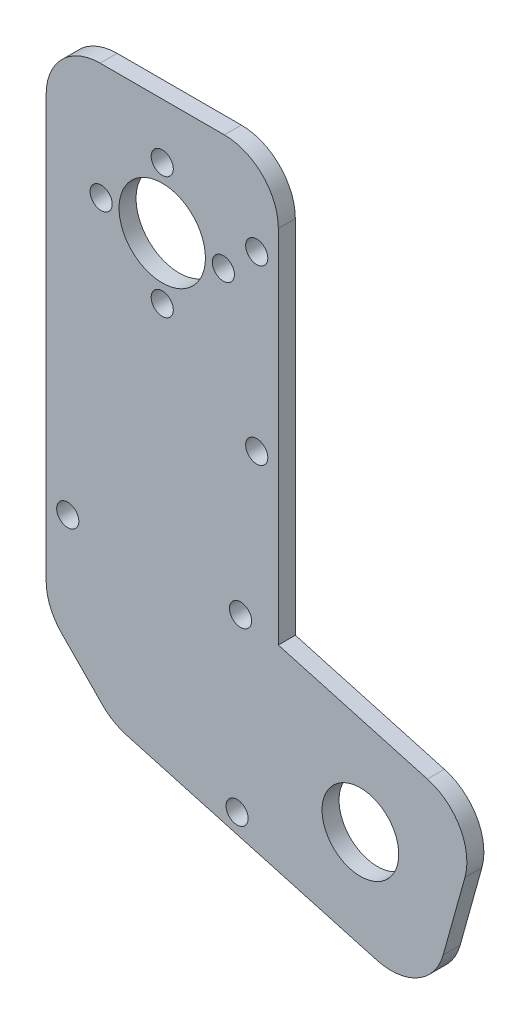
ISO-10303-21;
HEADER;
FILE_DESCRIPTION(('STEP AP214'),'2;1');
FILE_NAME('part.step','',(''),(''),'','','');
FILE_SCHEMA(('AUTOMOTIVE_DESIGN { 1 0 10303 214 1 1 1 1 }'));
ENDSEC;
DATA;
#1=APPLICATION_CONTEXT('core data for automotive mechanical design processes');
#2=APPLICATION_PROTOCOL_DEFINITION('international standard','automotive_design',2000,#1);
#3=PRODUCT_CONTEXT('',#1,'mechanical');
#4=PRODUCT('Part','Part','',(#3));
#5=PRODUCT_RELATED_PRODUCT_CATEGORY('part','',(#4));
#6=PRODUCT_DEFINITION_FORMATION('','',#4);
#7=PRODUCT_DEFINITION_CONTEXT('part definition',#1,'design');
#8=PRODUCT_DEFINITION('design','',#6,#7);
#9=PRODUCT_DEFINITION_SHAPE('','',#8);
#10=(LENGTH_UNIT() NAMED_UNIT(*) SI_UNIT(.MILLI.,.METRE.));
#11=(NAMED_UNIT(*) PLANE_ANGLE_UNIT() SI_UNIT($,.RADIAN.));
#12=(NAMED_UNIT(*) SI_UNIT($,.STERADIAN.) SOLID_ANGLE_UNIT());
#13=UNCERTAINTY_MEASURE_WITH_UNIT(LENGTH_MEASURE(1.E-05),#10,'distance_accuracy_value','');
#14=(GEOMETRIC_REPRESENTATION_CONTEXT(3) GLOBAL_UNCERTAINTY_ASSIGNED_CONTEXT((#13)) GLOBAL_UNIT_ASSIGNED_CONTEXT((#10,
#11,#12)) REPRESENTATION_CONTEXT('',''));
#15=CARTESIAN_POINT('',(0.,0.,0.));
#16=DIRECTION('',(0.,0.,1.));
#17=DIRECTION('',(1.,0.,0.));
#18=AXIS2_PLACEMENT_3D('',#15,#16,#17);
#19=CARTESIAN_POINT('',(338.738353449276,-520.512689349728,3.15));
#20=DIRECTION('',(0.,0.,1.));
#21=DIRECTION('',(1.,0.,0.));
#22=AXIS2_PLACEMENT_3D('',#19,#20,#21);
#23=PLANE('',#22);
#24=CARTESIAN_POINT('',(367.738353449277,-558.262689349727,3.15));
#25=DIRECTION('',(0.,0.,1.));
#26=DIRECTION('',(1.,0.,0.));
#27=AXIS2_PLACEMENT_3D('',#24,#25,#26);
#28=CIRCLE('',#27,2.05000000000001);
#29=CARTESIAN_POINT('',(369.788353449277,-558.262689349727,3.15));
#30=VERTEX_POINT('',#29);
#31=EDGE_CURVE('E475',#30,#30,#28,.T.);
#32=ORIENTED_EDGE('',*,*,#31,.F.);
#33=EDGE_LOOP('',(#32));
#34=FACE_BOUND('',#33,.T.);
#35=CARTESIAN_POINT('',(367.738353449277,-526.262689349727,3.15));
#36=DIRECTION('',(0.,0.,1.));
#37=DIRECTION('',(1.,0.,0.));
#38=AXIS2_PLACEMENT_3D('',#35,#36,#37);
#39=CIRCLE('',#38,2.05000000000001);
#40=CARTESIAN_POINT('',(369.788353449277,-526.262689349727,3.15));
#41=VERTEX_POINT('',#40);
#42=EDGE_CURVE('E482',#41,#41,#39,.T.);
#43=ORIENTED_EDGE('',*,*,#42,.F.);
#44=EDGE_LOOP('',(#43));
#45=FACE_BOUND('',#44,.T.);
#46=CARTESIAN_POINT('',(364.09835344927,-617.962689349723,3.15));
#47=DIRECTION('',(0.,0.,1.));
#48=DIRECTION('',(1.,0.,0.));
#49=AXIS2_PLACEMENT_3D('',#46,#47,#48);
#50=CIRCLE('',#49,2.05000000000001);
#51=CARTESIAN_POINT('',(366.14835344927,-617.962689349723,3.15));
#52=VERTEX_POINT('',#51);
#53=EDGE_CURVE('E498',#52,#52,#50,.T.);
#54=ORIENTED_EDGE('',*,*,#53,.F.);
#55=EDGE_LOOP('',(#54));
#56=FACE_BOUND('',#55,.T.);
#57=CARTESIAN_POINT('',(332.738353449277,-585.962689349728,3.15));
#58=DIRECTION('',(0.,0.,1.));
#59=DIRECTION('',(1.,0.,0.));
#60=AXIS2_PLACEMENT_3D('',#57,#58,#59);
#61=CIRCLE('',#60,2.05000000000001);
#62=CARTESIAN_POINT('',(334.788353449277,-585.962689349728,3.15));
#63=VERTEX_POINT('',#62);
#64=EDGE_CURVE('E514',#63,#63,#61,.T.);
#65=ORIENTED_EDGE('',*,*,#64,.F.);
#66=EDGE_LOOP('',(#65));
#67=FACE_BOUND('',#66,.T.);
#68=CARTESIAN_POINT('',(338.738353449276,-520.512689349728,3.15));
#69=DIRECTION('',(0.,0.,1.));
#70=DIRECTION('',(1.,0.,0.));
#71=AXIS2_PLACEMENT_3D('',#68,#69,#70);
#72=CIRCLE('',#71,9.99999999999973);
#73=CARTESIAN_POINT('',(338.738353449275,-510.512689349728,3.15));
#74=VERTEX_POINT('',#73);
#75=CARTESIAN_POINT('',(328.738353449277,-520.512689349728,3.15));
#76=VERTEX_POINT('',#75);
#77=EDGE_CURVE('E316',#74,#76,#72,.T.);
#78=ORIENTED_EDGE('',*,*,#77,.T.);
#79=DIRECTION('',(0.,-1.,0.));
#80=VECTOR('',#79,1.);
#81=CARTESIAN_POINT('',(328.738353449277,-520.512689349728,3.15));
#82=LINE('',#81,#80);
#83=CARTESIAN_POINT('',(328.738353449277,-598.517239389052,3.15));
#84=VERTEX_POINT('',#83);
#85=EDGE_CURVE('E222',#76,#84,#82,.T.);
#86=ORIENTED_EDGE('',*,*,#85,.T.);
#87=CARTESIAN_POINT('',(338.738353449279,-598.517239389052,3.15));
#88=DIRECTION('',(0.,0.,1.));
#89=DIRECTION('',(1.,0.,0.));
#90=AXIS2_PLACEMENT_3D('',#87,#88,#89);
#91=CIRCLE('',#90,10.0000000000021);
#92=CARTESIAN_POINT('',(331.605848957736,-605.526332032052,3.15));
#93=VERTEX_POINT('',#92);
#94=EDGE_CURVE('E357',#84,#93,#91,.T.);
#95=ORIENTED_EDGE('',*,*,#94,.T.);
#96=DIRECTION('',(0.700909264299887,-0.713250449154146,0.));
#97=VECTOR('',#96,1.);
#98=CARTESIAN_POINT('',(331.605848957736,-605.526332032052,3.15));
#99=LINE('',#98,#97);
#100=CARTESIAN_POINT('',(339.160008991501,-613.213501130105,3.15));
#101=VERTEX_POINT('',#100);
#102=EDGE_CURVE('E377',#93,#101,#99,.T.);
#103=ORIENTED_EDGE('',*,*,#102,.T.);
#104=CARTESIAN_POINT('',(346.292513483043,-606.204408487105,3.15));
#105=DIRECTION('',(0.,0.,1.));
#106=DIRECTION('',(1.,0.,0.));
#107=AXIS2_PLACEMENT_3D('',#104,#105,#106);
#108=CIRCLE('',#107,10.0000000000005);
#109=CARTESIAN_POINT('',(343.608612936547,-615.837511717971,3.15));
#110=VERTEX_POINT('',#109);
#111=EDGE_CURVE('E373',#101,#110,#108,.T.);
#112=ORIENTED_EDGE('',*,*,#111,.T.);
#113=DIRECTION('',(0.963310323086718,-0.268390054649131,0.));
#114=VECTOR('',#113,1.);
#115=CARTESIAN_POINT('',(343.608612936547,-615.837511717969,3.15));
#116=LINE('',#115,#114);
#117=CARTESIAN_POINT('',(389.943798738225,-628.747061996266,3.15));
#118=VERTEX_POINT('',#117);
#119=EDGE_CURVE('E376',#110,#118,#116,.T.);
#120=ORIENTED_EDGE('',*,*,#119,.T.);
#121=CARTESIAN_POINT('',(392.627699284721,-619.113958765401,3.15));
#122=DIRECTION('',(0.,0.,1.));
#123=DIRECTION('',(1.,0.,0.));
#124=AXIS2_PLACEMENT_3D('',#121,#122,#123);
#125=CIRCLE('',#124,9.99999999999827);
#126=CARTESIAN_POINT('',(402.260802515585,-621.797859311897,3.15));
#127=VERTEX_POINT('',#126);
#128=EDGE_CURVE('E381',#118,#127,#125,.T.);
#129=ORIENTED_EDGE('',*,*,#128,.T.);
#130=DIRECTION('',(0.268390054649557,0.963310323086599,0.));
#131=VECTOR('',#130,1.);
#132=CARTESIAN_POINT('',(402.260802515584,-621.797859311897,3.15));
#133=LINE('',#132,#131);
#134=CARTESIAN_POINT('',(406.28749809308,-607.345172446158,3.15));
#135=VERTEX_POINT('',#134);
#136=EDGE_CURVE('E388',#127,#135,#133,.T.);
#137=ORIENTED_EDGE('',*,*,#136,.T.);
#138=CARTESIAN_POINT('',(396.654394862209,-604.661271899663,3.15));
#139=DIRECTION('',(0.,0.,1.));
#140=DIRECTION('',(1.,0.,0.));
#141=AXIS2_PLACEMENT_3D('',#138,#139,#140);
#142=CIRCLE('',#141,10.0000000000016);
#143=CARTESIAN_POINT('',(399.338295408697,-595.028168668793,3.15));
#144=VERTEX_POINT('',#143);
#145=EDGE_CURVE('E391',#135,#144,#142,.T.);
#146=ORIENTED_EDGE('',*,*,#145,.T.);
#147=DIRECTION('',(-0.963310323086717,0.268390054649132,0.));
#148=VECTOR('',#147,1.);
#149=CARTESIAN_POINT('',(399.338295408697,-595.028168668796,3.15));
#150=LINE('',#149,#148);
#151=CARTESIAN_POINT('',(371.738353449277,-587.338486794459,3.15));
#152=VERTEX_POINT('',#151);
#153=EDGE_CURVE('E256',#144,#152,#150,.T.);
#154=ORIENTED_EDGE('',*,*,#153,.T.);
#155=DIRECTION('',(0.,1.,0.));
#156=VECTOR('',#155,1.);
#157=CARTESIAN_POINT('',(371.738353449277,-587.338486794459,3.15));
#158=LINE('',#157,#156);
#159=CARTESIAN_POINT('',(371.738353449277,-520.512689349726,3.15));
#160=VERTEX_POINT('',#159);
#161=EDGE_CURVE('E250',#152,#160,#158,.T.);
#162=ORIENTED_EDGE('',*,*,#161,.T.);
#163=CARTESIAN_POINT('',(361.738353449276,-520.512689349727,3.15));
#164=DIRECTION('',(0.,0.,1.));
#165=DIRECTION('',(1.,0.,0.));
#166=AXIS2_PLACEMENT_3D('',#163,#164,#165);
#167=CIRCLE('',#166,10.0000000000001);
#168=CARTESIAN_POINT('',(361.738353449275,-510.512689349727,3.15));
#169=VERTEX_POINT('',#168);
#170=EDGE_CURVE('E254',#160,#169,#167,.T.);
#171=ORIENTED_EDGE('',*,*,#170,.T.);
#172=DIRECTION('',(-1.,0.,0.));
#173=VECTOR('',#172,1.);
#174=CARTESIAN_POINT('',(361.738353449275,-510.512689349727,3.15));
#175=LINE('',#174,#173);
#176=EDGE_CURVE('E164',#169,#74,#175,.T.);
#177=ORIENTED_EDGE('',*,*,#176,.T.);
#178=EDGE_LOOP('',(#78,#86,#95,#103,#112,#120,#129,#137,#146,#154,#162,#171,#177));
#179=FACE_BOUND('',#178,.T.);
#180=CARTESIAN_POINT('',(364.738353449277,-585.962689349726,3.15));
#181=DIRECTION('',(0.,0.,1.));
#182=DIRECTION('',(1.,0.,0.));
#183=AXIS2_PLACEMENT_3D('',#180,#181,#182);
#184=CIRCLE('',#183,2.05000000000001);
#185=CARTESIAN_POINT('',(366.788353449277,-585.962689349726,3.15));
#186=VERTEX_POINT('',#185);
#187=EDGE_CURVE('E506',#186,#186,#184,.T.);
#188=ORIENTED_EDGE('',*,*,#187,.F.);
#189=EDGE_LOOP('',(#188));
#190=FACE_BOUND('',#189,.T.);
#191=CARTESIAN_POINT('',(386.934986867648,-609.73897888562,3.15));
#192=DIRECTION('',(0.,0.,1.));
#193=DIRECTION('',(1.,0.,0.));
#194=AXIS2_PLACEMENT_3D('',#191,#192,#193);
#195=CIRCLE('',#194,7.09999999999959);
#196=CARTESIAN_POINT('',(394.034986867648,-609.73897888562,3.15));
#197=VERTEX_POINT('',#196);
#198=EDGE_CURVE('E490',#197,#197,#195,.T.);
#199=ORIENTED_EDGE('',*,*,#198,.F.);
#200=EDGE_LOOP('',(#199));
#201=FACE_BOUND('',#200,.T.);
#202=CARTESIAN_POINT('',(350.23835344928,-543.326397848709,3.15));
#203=DIRECTION('',(0.,0.,1.));
#204=DIRECTION('',(1.,0.,0.));
#205=AXIS2_PLACEMENT_3D('',#202,#203,#204);
#206=CIRCLE('',#205,2.05000000000001);
#207=CARTESIAN_POINT('',(352.28835344928,-543.326397848709,3.15));
#208=VERTEX_POINT('',#207);
#209=EDGE_CURVE('E530',#208,#208,#206,.T.);
#210=ORIENTED_EDGE('',*,*,#209,.F.);
#211=EDGE_LOOP('',(#210));
#212=FACE_BOUND('',#211,.T.);
#213=CARTESIAN_POINT('',(350.23835344928,-520.69898085074,3.15));
#214=DIRECTION('',(0.,0.,1.));
#215=DIRECTION('',(1.,0.,0.));
#216=AXIS2_PLACEMENT_3D('',#213,#214,#215);
#217=CIRCLE('',#216,2.05000000000001);
#218=CARTESIAN_POINT('',(352.28835344928,-520.69898085074,3.15));
#219=VERTEX_POINT('',#218);
#220=EDGE_CURVE('E546',#219,#219,#217,.T.);
#221=ORIENTED_EDGE('',*,*,#220,.F.);
#222=EDGE_LOOP('',(#221));
#223=FACE_BOUND('',#222,.T.);
#224=CARTESIAN_POINT('',(350.23835344928,-532.012689349725,3.15));
#225=DIRECTION('',(0.,0.,1.));
#226=DIRECTION('',(1.,0.,0.));
#227=AXIS2_PLACEMENT_3D('',#224,#225,#226);
#228=CIRCLE('',#227,7.99999999999667);
#229=CARTESIAN_POINT('',(358.238353449277,-532.012689349725,3.15));
#230=VERTEX_POINT('',#229);
#231=EDGE_CURVE('E283',#230,#230,#228,.T.);
#232=ORIENTED_EDGE('',*,*,#231,.F.);
#233=EDGE_LOOP('',(#232));
#234=FACE_BOUND('',#233,.T.);
#235=CARTESIAN_POINT('',(361.552061948265,-532.012689349725,3.15));
#236=DIRECTION('',(0.,0.,1.));
#237=DIRECTION('',(1.,0.,0.));
#238=AXIS2_PLACEMENT_3D('',#235,#236,#237);
#239=CIRCLE('',#238,2.05000000000001);
#240=CARTESIAN_POINT('',(363.602061948265,-532.012689349725,3.15));
#241=VERTEX_POINT('',#240);
#242=EDGE_CURVE('E538',#241,#241,#239,.T.);
#243=ORIENTED_EDGE('',*,*,#242,.F.);
#244=EDGE_LOOP('',(#243));
#245=FACE_BOUND('',#244,.T.);
#246=CARTESIAN_POINT('',(338.924644950296,-532.012689349725,3.15));
#247=DIRECTION('',(0.,0.,1.));
#248=DIRECTION('',(1.,0.,0.));
#249=AXIS2_PLACEMENT_3D('',#246,#247,#248);
#250=CIRCLE('',#249,2.05000000000001);
#251=CARTESIAN_POINT('',(340.974644950296,-532.012689349725,3.15));
#252=VERTEX_POINT('',#251);
#253=EDGE_CURVE('E522',#252,#252,#250,.T.);
#254=ORIENTED_EDGE('',*,*,#253,.F.);
#255=EDGE_LOOP('',(#254));
#256=FACE_BOUND('',#255,.T.);
#257=ADVANCED_FACE('F146',(#34,#45,#56,#67,#179,#190,#201,#212,#223,#234,#245,#256),#23,.T.);
#258=CARTESIAN_POINT('',(338.738353449276,-520.512689349728,0.));
#259=DIRECTION('',(0.,0.,1.));
#260=DIRECTION('',(1.,0.,0.));
#261=AXIS2_PLACEMENT_3D('',#258,#259,#260);
#262=PLANE('',#261);
#263=CARTESIAN_POINT('',(367.738353449277,-558.262689349727,0.));
#264=DIRECTION('',(0.,0.,1.));
#265=DIRECTION('',(1.,0.,0.));
#266=AXIS2_PLACEMENT_3D('',#263,#264,#265);
#267=CIRCLE('',#266,2.05000000000001);
#268=CARTESIAN_POINT('',(369.788353449277,-558.262689349727,0.));
#269=VERTEX_POINT('',#268);
#270=EDGE_CURVE('E473',#269,#269,#267,.T.);
#271=ORIENTED_EDGE('',*,*,#270,.T.);
#272=EDGE_LOOP('',(#271));
#273=FACE_BOUND('',#272,.T.);
#274=CARTESIAN_POINT('',(367.738353449277,-526.262689349727,0.));
#275=DIRECTION('',(0.,0.,1.));
#276=DIRECTION('',(1.,0.,0.));
#277=AXIS2_PLACEMENT_3D('',#274,#275,#276);
#278=CIRCLE('',#277,2.05000000000001);
#279=CARTESIAN_POINT('',(369.788353449277,-526.262689349727,0.));
#280=VERTEX_POINT('',#279);
#281=EDGE_CURVE('E477',#280,#280,#278,.T.);
#282=ORIENTED_EDGE('',*,*,#281,.T.);
#283=EDGE_LOOP('',(#282));
#284=FACE_BOUND('',#283,.T.);
#285=CARTESIAN_POINT('',(338.738353449276,-520.512689349728,0.));
#286=DIRECTION('',(0.,0.,1.));
#287=DIRECTION('',(1.,0.,0.));
#288=AXIS2_PLACEMENT_3D('',#285,#286,#287);
#289=CIRCLE('',#288,9.99999999999973);
#290=CARTESIAN_POINT('',(338.738353449275,-510.512689349728,0.));
#291=VERTEX_POINT('',#290);
#292=CARTESIAN_POINT('',(328.738353449277,-520.512689349728,0.));
#293=VERTEX_POINT('',#292);
#294=EDGE_CURVE('E278',#291,#293,#289,.T.);
#295=ORIENTED_EDGE('',*,*,#294,.F.);
#296=DIRECTION('',(-1.,0.,0.));
#297=VECTOR('',#296,1.);
#298=CARTESIAN_POINT('',(361.738353449275,-510.512689349727,0.));
#299=LINE('',#298,#297);
#300=CARTESIAN_POINT('',(361.738353449275,-510.512689349727,0.));
#301=VERTEX_POINT('',#300);
#302=EDGE_CURVE('E214',#301,#291,#299,.T.);
#303=ORIENTED_EDGE('',*,*,#302,.F.);
#304=CARTESIAN_POINT('',(361.738353449276,-520.512689349727,0.));
#305=DIRECTION('',(0.,0.,1.));
#306=DIRECTION('',(1.,0.,0.));
#307=AXIS2_PLACEMENT_3D('',#304,#305,#306);
#308=CIRCLE('',#307,10.0000000000001);
#309=CARTESIAN_POINT('',(371.738353449277,-520.512689349726,0.));
#310=VERTEX_POINT('',#309);
#311=EDGE_CURVE('E208',#310,#301,#308,.T.);
#312=ORIENTED_EDGE('',*,*,#311,.F.);
#313=DIRECTION('',(0.,1.,0.));
#314=VECTOR('',#313,1.);
#315=CARTESIAN_POINT('',(371.738353449277,-587.338486794459,0.));
#316=LINE('',#315,#314);
#317=CARTESIAN_POINT('',(371.738353449277,-587.338486794459,0.));
#318=VERTEX_POINT('',#317);
#319=EDGE_CURVE('E265',#318,#310,#316,.T.);
#320=ORIENTED_EDGE('',*,*,#319,.F.);
#321=DIRECTION('',(-0.963310323086717,0.268390054649132,0.));
#322=VECTOR('',#321,1.);
#323=CARTESIAN_POINT('',(399.338295408697,-595.028168668796,0.));
#324=LINE('',#323,#322);
#325=CARTESIAN_POINT('',(399.338295408697,-595.028168668793,0.));
#326=VERTEX_POINT('',#325);
#327=EDGE_CURVE('E307',#326,#318,#324,.T.);
#328=ORIENTED_EDGE('',*,*,#327,.F.);
#329=CARTESIAN_POINT('',(396.654394862209,-604.661271899663,0.));
#330=DIRECTION('',(0.,0.,1.));
#331=DIRECTION('',(1.,0.,0.));
#332=AXIS2_PLACEMENT_3D('',#329,#330,#331);
#333=CIRCLE('',#332,10.0000000000016);
#334=CARTESIAN_POINT('',(406.28749809308,-607.345172446158,0.));
#335=VERTEX_POINT('',#334);
#336=EDGE_CURVE('E304',#335,#326,#333,.T.);
#337=ORIENTED_EDGE('',*,*,#336,.F.);
#338=DIRECTION('',(0.268390054649557,0.963310323086599,0.));
#339=VECTOR('',#338,1.);
#340=CARTESIAN_POINT('',(402.260802515584,-621.797859311897,0.));
#341=LINE('',#340,#339);
#342=CARTESIAN_POINT('',(402.260802515585,-621.797859311897,0.));
#343=VERTEX_POINT('',#342);
#344=EDGE_CURVE('E301',#343,#335,#341,.T.);
#345=ORIENTED_EDGE('',*,*,#344,.F.);
#346=CARTESIAN_POINT('',(392.627699284721,-619.113958765401,0.));
#347=DIRECTION('',(0.,0.,1.));
#348=DIRECTION('',(1.,0.,0.));
#349=AXIS2_PLACEMENT_3D('',#346,#347,#348);
#350=CIRCLE('',#349,9.99999999999827);
#351=CARTESIAN_POINT('',(389.943798738225,-628.747061996266,0.));
#352=VERTEX_POINT('',#351);
#353=EDGE_CURVE('E298',#352,#343,#350,.T.);
#354=ORIENTED_EDGE('',*,*,#353,.F.);
#355=DIRECTION('',(0.963310323086718,-0.268390054649131,0.));
#356=VECTOR('',#355,1.);
#357=CARTESIAN_POINT('',(343.608612936547,-615.837511717969,0.));
#358=LINE('',#357,#356);
#359=CARTESIAN_POINT('',(343.608612936547,-615.837511717971,0.));
#360=VERTEX_POINT('',#359);
#361=EDGE_CURVE('E295',#360,#352,#358,.T.);
#362=ORIENTED_EDGE('',*,*,#361,.F.);
#363=CARTESIAN_POINT('',(346.292513483043,-606.204408487105,0.));
#364=DIRECTION('',(0.,0.,1.));
#365=DIRECTION('',(1.,0.,0.));
#366=AXIS2_PLACEMENT_3D('',#363,#364,#365);
#367=CIRCLE('',#366,10.0000000000005);
#368=CARTESIAN_POINT('',(339.160008991501,-613.213501130105,0.));
#369=VERTEX_POINT('',#368);
#370=EDGE_CURVE('E292',#369,#360,#367,.T.);
#371=ORIENTED_EDGE('',*,*,#370,.F.);
#372=DIRECTION('',(0.700909264299887,-0.713250449154146,0.));
#373=VECTOR('',#372,1.);
#374=CARTESIAN_POINT('',(331.605848957736,-605.526332032052,0.));
#375=LINE('',#374,#373);
#376=CARTESIAN_POINT('',(331.605848957736,-605.526332032052,0.));
#377=VERTEX_POINT('',#376);
#378=EDGE_CURVE('E289',#377,#369,#375,.T.);
#379=ORIENTED_EDGE('',*,*,#378,.F.);
#380=CARTESIAN_POINT('',(338.738353449279,-598.517239389052,0.));
#381=DIRECTION('',(0.,0.,1.));
#382=DIRECTION('',(1.,0.,0.));
#383=AXIS2_PLACEMENT_3D('',#380,#381,#382);
#384=CIRCLE('',#383,10.0000000000021);
#385=CARTESIAN_POINT('',(328.738353449277,-598.517239389052,0.));
#386=VERTEX_POINT('',#385);
#387=EDGE_CURVE('E286',#386,#377,#384,.T.);
#388=ORIENTED_EDGE('',*,*,#387,.F.);
#389=DIRECTION('',(0.,-1.,0.));
#390=VECTOR('',#389,1.);
#391=CARTESIAN_POINT('',(328.738353449277,-520.512689349728,0.));
#392=LINE('',#391,#390);
#393=EDGE_CURVE('E282',#293,#386,#392,.T.);
#394=ORIENTED_EDGE('',*,*,#393,.F.);
#395=EDGE_LOOP('',(#295,#303,#312,#320,#328,#337,#345,#354,#362,#371,#379,#388,#394));
#396=FACE_BOUND('',#395,.T.);
#397=CARTESIAN_POINT('',(332.738353449277,-585.962689349728,0.));
#398=DIRECTION('',(0.,0.,1.));
#399=DIRECTION('',(1.,0.,0.));
#400=AXIS2_PLACEMENT_3D('',#397,#398,#399);
#401=CIRCLE('',#400,2.05000000000001);
#402=CARTESIAN_POINT('',(334.788353449277,-585.962689349728,0.));
#403=VERTEX_POINT('',#402);
#404=EDGE_CURVE('E510',#403,#403,#401,.T.);
#405=ORIENTED_EDGE('',*,*,#404,.T.);
#406=EDGE_LOOP('',(#405));
#407=FACE_BOUND('',#406,.T.);
#408=CARTESIAN_POINT('',(364.738353449277,-585.962689349726,0.));
#409=DIRECTION('',(0.,0.,1.));
#410=DIRECTION('',(1.,0.,0.));
#411=AXIS2_PLACEMENT_3D('',#408,#409,#410);
#412=CIRCLE('',#411,2.05000000000001);
#413=CARTESIAN_POINT('',(366.788353449277,-585.962689349726,0.));
#414=VERTEX_POINT('',#413);
#415=EDGE_CURVE('E502',#414,#414,#412,.T.);
#416=ORIENTED_EDGE('',*,*,#415,.T.);
#417=EDGE_LOOP('',(#416));
#418=FACE_BOUND('',#417,.T.);
#419=CARTESIAN_POINT('',(364.09835344927,-617.962689349723,0.));
#420=DIRECTION('',(0.,0.,1.));
#421=DIRECTION('',(1.,0.,0.));
#422=AXIS2_PLACEMENT_3D('',#419,#420,#421);
#423=CIRCLE('',#422,2.05000000000001);
#424=CARTESIAN_POINT('',(366.14835344927,-617.962689349723,0.));
#425=VERTEX_POINT('',#424);
#426=EDGE_CURVE('E494',#425,#425,#423,.T.);
#427=ORIENTED_EDGE('',*,*,#426,.T.);
#428=EDGE_LOOP('',(#427));
#429=FACE_BOUND('',#428,.T.);
#430=CARTESIAN_POINT('',(386.934986867648,-609.73897888562,0.));
#431=DIRECTION('',(0.,0.,1.));
#432=DIRECTION('',(1.,0.,0.));
#433=AXIS2_PLACEMENT_3D('',#430,#431,#432);
#434=CIRCLE('',#433,7.09999999999959);
#435=CARTESIAN_POINT('',(394.034986867648,-609.73897888562,0.));
#436=VERTEX_POINT('',#435);
#437=EDGE_CURVE('E488',#436,#436,#434,.T.);
#438=ORIENTED_EDGE('',*,*,#437,.T.);
#439=EDGE_LOOP('',(#438));
#440=FACE_BOUND('',#439,.T.);
#441=CARTESIAN_POINT('',(350.23835344928,-532.012689349725,0.));
#442=DIRECTION('',(0.,0.,1.));
#443=DIRECTION('',(1.,0.,0.));
#444=AXIS2_PLACEMENT_3D('',#441,#442,#443);
#445=CIRCLE('',#444,7.99999999999667);
#446=CARTESIAN_POINT('',(358.238353449277,-532.012689349725,0.));
#447=VERTEX_POINT('',#446);
#448=EDGE_CURVE('E550',#447,#447,#445,.T.);
#449=ORIENTED_EDGE('',*,*,#448,.T.);
#450=EDGE_LOOP('',(#449));
#451=FACE_BOUND('',#450,.T.);
#452=CARTESIAN_POINT('',(350.23835344928,-520.69898085074,0.));
#453=DIRECTION('',(0.,0.,1.));
#454=DIRECTION('',(1.,0.,0.));
#455=AXIS2_PLACEMENT_3D('',#452,#453,#454);
#456=CIRCLE('',#455,2.05000000000001);
#457=CARTESIAN_POINT('',(352.28835344928,-520.69898085074,0.));
#458=VERTEX_POINT('',#457);
#459=EDGE_CURVE('E542',#458,#458,#456,.T.);
#460=ORIENTED_EDGE('',*,*,#459,.T.);
#461=EDGE_LOOP('',(#460));
#462=FACE_BOUND('',#461,.T.);
#463=CARTESIAN_POINT('',(361.552061948265,-532.012689349725,0.));
#464=DIRECTION('',(0.,0.,1.));
#465=DIRECTION('',(1.,0.,0.));
#466=AXIS2_PLACEMENT_3D('',#463,#464,#465);
#467=CIRCLE('',#466,2.05000000000001);
#468=CARTESIAN_POINT('',(363.602061948265,-532.012689349725,0.));
#469=VERTEX_POINT('',#468);
#470=EDGE_CURVE('E534',#469,#469,#467,.T.);
#471=ORIENTED_EDGE('',*,*,#470,.T.);
#472=EDGE_LOOP('',(#471));
#473=FACE_BOUND('',#472,.T.);
#474=CARTESIAN_POINT('',(350.23835344928,-543.326397848709,0.));
#475=DIRECTION('',(0.,0.,1.));
#476=DIRECTION('',(1.,0.,0.));
#477=AXIS2_PLACEMENT_3D('',#474,#475,#476);
#478=CIRCLE('',#477,2.05000000000001);
#479=CARTESIAN_POINT('',(352.28835344928,-543.326397848709,0.));
#480=VERTEX_POINT('',#479);
#481=EDGE_CURVE('E526',#480,#480,#478,.T.);
#482=ORIENTED_EDGE('',*,*,#481,.T.);
#483=EDGE_LOOP('',(#482));
#484=FACE_BOUND('',#483,.T.);
#485=CARTESIAN_POINT('',(338.924644950296,-532.012689349725,0.));
#486=DIRECTION('',(0.,0.,1.));
#487=DIRECTION('',(1.,0.,0.));
#488=AXIS2_PLACEMENT_3D('',#485,#486,#487);
#489=CIRCLE('',#488,2.05000000000001);
#490=CARTESIAN_POINT('',(340.974644950296,-532.012689349725,0.));
#491=VERTEX_POINT('',#490);
#492=EDGE_CURVE('E518',#491,#491,#489,.T.);
#493=ORIENTED_EDGE('',*,*,#492,.T.);
#494=EDGE_LOOP('',(#493));
#495=FACE_BOUND('',#494,.T.);
#496=ADVANCED_FACE('F361',(#273,#284,#396,#407,#418,#429,#440,#451,#462,#473,#484,#495),#262,.F.);
#497=CARTESIAN_POINT('',(338.738353449276,-520.512689349728,3.15));
#498=DIRECTION('',(0.,0.,-1.));
#499=DIRECTION('',(-1.,0.,0.));
#500=AXIS2_PLACEMENT_3D('',#497,#498,#499);
#501=CYLINDRICAL_SURFACE('',#500,9.99999999999973);
#502=ORIENTED_EDGE('',*,*,#294,.T.);
#503=DIRECTION('',(0.,0.,-1.));
#504=VECTOR('',#503,1.);
#505=CARTESIAN_POINT('',(328.738353449277,-520.512689349728,3.15));
#506=LINE('',#505,#504);
#507=EDGE_CURVE('E12',#76,#293,#506,.T.);
#508=ORIENTED_EDGE('',*,*,#507,.F.);
#509=ORIENTED_EDGE('',*,*,#77,.F.);
#510=DIRECTION('',(0.,0.,-1.));
#511=VECTOR('',#510,1.);
#512=CARTESIAN_POINT('',(338.738353449275,-510.512689349728,3.15));
#513=LINE('',#512,#511);
#514=EDGE_CURVE('E274',#74,#291,#513,.T.);
#515=ORIENTED_EDGE('',*,*,#514,.T.);
#516=EDGE_LOOP('',(#502,#508,#509,#515));
#517=FACE_BOUND('',#516,.T.);
#518=ADVANCED_FACE('F148',(#517),#501,.T.);
#519=CARTESIAN_POINT('',(328.738353449277,-520.512689349728,3.15));
#520=DIRECTION('',(1.,0.,0.));
#521=DIRECTION('',(0.,1.,0.));
#522=AXIS2_PLACEMENT_3D('',#519,#520,#521);
#523=PLANE('',#522);
#524=ORIENTED_EDGE('',*,*,#393,.T.);
#525=DIRECTION('',(0.,0.,-1.));
#526=VECTOR('',#525,1.);
#527=CARTESIAN_POINT('',(328.738353449277,-598.517239389052,3.15));
#528=LINE('',#527,#526);
#529=EDGE_CURVE('E156',#84,#386,#528,.T.);
#530=ORIENTED_EDGE('',*,*,#529,.F.);
#531=ORIENTED_EDGE('',*,*,#85,.F.);
#532=ORIENTED_EDGE('',*,*,#507,.T.);
#533=EDGE_LOOP('',(#524,#530,#531,#532));
#534=FACE_BOUND('',#533,.T.);
#535=ADVANCED_FACE('F741',(#534),#523,.F.);
#536=CARTESIAN_POINT('',(338.738353449279,-598.517239389052,3.15));
#537=DIRECTION('',(0.,0.,-1.));
#538=DIRECTION('',(-1.,0.,0.));
#539=AXIS2_PLACEMENT_3D('',#536,#537,#538);
#540=CYLINDRICAL_SURFACE('',#539,10.0000000000021);
#541=ORIENTED_EDGE('',*,*,#387,.T.);
#542=DIRECTION('',(0.,0.,-1.));
#543=VECTOR('',#542,1.);
#544=CARTESIAN_POINT('',(331.605848957736,-605.526332032052,3.15));
#545=LINE('',#544,#543);
#546=EDGE_CURVE('E347',#93,#377,#545,.T.);
#547=ORIENTED_EDGE('',*,*,#546,.F.);
#548=ORIENTED_EDGE('',*,*,#94,.F.);
#549=ORIENTED_EDGE('',*,*,#529,.T.);
#550=EDGE_LOOP('',(#541,#547,#548,#549));
#551=FACE_BOUND('',#550,.T.);
#552=ADVANCED_FACE('F355',(#551),#540,.T.);
#553=CARTESIAN_POINT('',(331.605848957736,-605.526332032052,3.15));
#554=DIRECTION('',(0.713250449154146,0.700909264299887,0.));
#555=DIRECTION('',(-0.700909264299887,0.713250449154146,0.));
#556=AXIS2_PLACEMENT_3D('',#553,#554,#555);
#557=PLANE('',#556);
#558=ORIENTED_EDGE('',*,*,#378,.T.);
#559=DIRECTION('',(0.,0.,-1.));
#560=VECTOR('',#559,1.);
#561=CARTESIAN_POINT('',(339.160008991501,-613.213501130105,3.15));
#562=LINE('',#561,#560);
#563=EDGE_CURVE('E343',#101,#369,#562,.T.);
#564=ORIENTED_EDGE('',*,*,#563,.F.);
#565=ORIENTED_EDGE('',*,*,#102,.F.);
#566=ORIENTED_EDGE('',*,*,#546,.T.);
#567=EDGE_LOOP('',(#558,#564,#565,#566));
#568=FACE_BOUND('',#567,.T.);
#569=ADVANCED_FACE('F367',(#568),#557,.F.);
#570=CARTESIAN_POINT('',(346.292513483043,-606.204408487105,3.15));
#571=DIRECTION('',(0.,0.,-1.));
#572=DIRECTION('',(-1.,0.,0.));
#573=AXIS2_PLACEMENT_3D('',#570,#571,#572);
#574=CYLINDRICAL_SURFACE('',#573,10.0000000000005);
#575=ORIENTED_EDGE('',*,*,#370,.T.);
#576=DIRECTION('',(0.,0.,-1.));
#577=VECTOR('',#576,1.);
#578=CARTESIAN_POINT('',(343.608612936547,-615.837511717971,3.15));
#579=LINE('',#578,#577);
#580=EDGE_CURVE('E339',#110,#360,#579,.T.);
#581=ORIENTED_EDGE('',*,*,#580,.F.);
#582=ORIENTED_EDGE('',*,*,#111,.F.);
#583=ORIENTED_EDGE('',*,*,#563,.T.);
#584=EDGE_LOOP('',(#575,#581,#582,#583));
#585=FACE_BOUND('',#584,.T.);
#586=ADVANCED_FACE('F371',(#585),#574,.T.);
#587=CARTESIAN_POINT('',(343.608612936547,-615.837511717969,3.15));
#588=DIRECTION('',(0.268390054649131,0.963310323086718,0.));
#589=DIRECTION('',(-0.963310323086718,0.268390054649131,0.));
#590=AXIS2_PLACEMENT_3D('',#587,#588,#589);
#591=PLANE('',#590);
#592=ORIENTED_EDGE('',*,*,#361,.T.);
#593=DIRECTION('',(0.,0.,-1.));
#594=VECTOR('',#593,1.);
#595=CARTESIAN_POINT('',(389.943798738225,-628.747061996266,3.15));
#596=LINE('',#595,#594);
#597=EDGE_CURVE('E335',#118,#352,#596,.T.);
#598=ORIENTED_EDGE('',*,*,#597,.F.);
#599=ORIENTED_EDGE('',*,*,#119,.F.);
#600=ORIENTED_EDGE('',*,*,#580,.T.);
#601=EDGE_LOOP('',(#592,#598,#599,#600));
#602=FACE_BOUND('',#601,.T.);
#603=ADVANCED_FACE('F706',(#602),#591,.F.);
#604=CARTESIAN_POINT('',(392.627699284721,-619.113958765401,3.15));
#605=DIRECTION('',(0.,0.,-1.));
#606=DIRECTION('',(-1.,0.,0.));
#607=AXIS2_PLACEMENT_3D('',#604,#605,#606);
#608=CYLINDRICAL_SURFACE('',#607,9.99999999999827);
#609=ORIENTED_EDGE('',*,*,#353,.T.);
#610=DIRECTION('',(0.,0.,-1.));
#611=VECTOR('',#610,1.);
#612=CARTESIAN_POINT('',(402.260802515585,-621.797859311897,3.15));
#613=LINE('',#612,#611);
#614=EDGE_CURVE('E331',#127,#343,#613,.T.);
#615=ORIENTED_EDGE('',*,*,#614,.F.);
#616=ORIENTED_EDGE('',*,*,#128,.F.);
#617=ORIENTED_EDGE('',*,*,#597,.T.);
#618=EDGE_LOOP('',(#609,#615,#616,#617));
#619=FACE_BOUND('',#618,.T.);
#620=ADVANCED_FACE('F696',(#619),#608,.T.);
#621=CARTESIAN_POINT('',(402.260802515584,-621.797859311897,3.15));
#622=DIRECTION('',(-0.963310323086599,0.268390054649557,0.));
#623=DIRECTION('',(-0.268390054649557,-0.963310323086599,0.));
#624=AXIS2_PLACEMENT_3D('',#621,#622,#623);
#625=PLANE('',#624);
#626=ORIENTED_EDGE('',*,*,#344,.T.);
#627=DIRECTION('',(0.,0.,-1.));
#628=VECTOR('',#627,1.);
#629=CARTESIAN_POINT('',(406.28749809308,-607.345172446158,3.15));
#630=LINE('',#629,#628);
#631=EDGE_CURVE('E327',#135,#335,#630,.T.);
#632=ORIENTED_EDGE('',*,*,#631,.F.);
#633=ORIENTED_EDGE('',*,*,#136,.F.);
#634=ORIENTED_EDGE('',*,*,#614,.T.);
#635=EDGE_LOOP('',(#626,#632,#633,#634));
#636=FACE_BOUND('',#635,.T.);
#637=ADVANCED_FACE('F687',(#636),#625,.F.);
#638=CARTESIAN_POINT('',(396.654394862209,-604.661271899663,3.15));
#639=DIRECTION('',(0.,0.,-1.));
#640=DIRECTION('',(-1.,0.,0.));
#641=AXIS2_PLACEMENT_3D('',#638,#639,#640);
#642=CYLINDRICAL_SURFACE('',#641,10.0000000000016);
#643=ORIENTED_EDGE('',*,*,#336,.T.);
#644=DIRECTION('',(0.,0.,-1.));
#645=VECTOR('',#644,1.);
#646=CARTESIAN_POINT('',(399.338295408697,-595.028168668793,3.15));
#647=LINE('',#646,#645);
#648=EDGE_CURVE('E323',#144,#326,#647,.T.);
#649=ORIENTED_EDGE('',*,*,#648,.F.);
#650=ORIENTED_EDGE('',*,*,#145,.F.);
#651=ORIENTED_EDGE('',*,*,#631,.T.);
#652=EDGE_LOOP('',(#643,#649,#650,#651));
#653=FACE_BOUND('',#652,.T.);
#654=ADVANCED_FACE('F399',(#653),#642,.T.);
#655=CARTESIAN_POINT('',(399.338295408697,-595.028168668796,3.15));
#656=DIRECTION('',(-0.268390054649132,-0.963310323086718,0.));
#657=DIRECTION('',(0.963310323086718,-0.268390054649132,0.));
#658=AXIS2_PLACEMENT_3D('',#655,#656,#657);
#659=PLANE('',#658);
#660=ORIENTED_EDGE('',*,*,#327,.T.);
#661=DIRECTION('',(0.,0.,-1.));
#662=VECTOR('',#661,1.);
#663=CARTESIAN_POINT('',(371.738353449277,-587.338486794459,3.15));
#664=LINE('',#663,#662);
#665=EDGE_CURVE('E267',#152,#318,#664,.T.);
#666=ORIENTED_EDGE('',*,*,#665,.F.);
#667=ORIENTED_EDGE('',*,*,#153,.F.);
#668=ORIENTED_EDGE('',*,*,#648,.T.);
#669=EDGE_LOOP('',(#660,#666,#667,#668));
#670=FACE_BOUND('',#669,.T.);
#671=ADVANCED_FACE('F403',(#670),#659,.F.);
#672=CARTESIAN_POINT('',(371.738353449277,-587.338486794459,3.15));
#673=DIRECTION('',(-1.,0.,0.));
#674=DIRECTION('',(0.,-1.,0.));
#675=AXIS2_PLACEMENT_3D('',#672,#673,#674);
#676=PLANE('',#675);
#677=ORIENTED_EDGE('',*,*,#319,.T.);
#678=DIRECTION('',(0.,0.,-1.));
#679=VECTOR('',#678,1.);
#680=CARTESIAN_POINT('',(371.738353449277,-520.512689349726,3.15));
#681=LINE('',#680,#679);
#682=EDGE_CURVE('E262',#160,#310,#681,.T.);
#683=ORIENTED_EDGE('',*,*,#682,.F.);
#684=ORIENTED_EDGE('',*,*,#161,.F.);
#685=ORIENTED_EDGE('',*,*,#665,.T.);
#686=EDGE_LOOP('',(#677,#683,#684,#685));
#687=FACE_BOUND('',#686,.T.);
#688=ADVANCED_FACE('F263',(#687),#676,.F.);
#689=CARTESIAN_POINT('',(361.738353449276,-520.512689349727,3.15));
#690=DIRECTION('',(0.,0.,-1.));
#691=DIRECTION('',(-1.,0.,0.));
#692=AXIS2_PLACEMENT_3D('',#689,#690,#691);
#693=CYLINDRICAL_SURFACE('',#692,10.0000000000001);
#694=ORIENTED_EDGE('',*,*,#311,.T.);
#695=DIRECTION('',(0.,0.,-1.));
#696=VECTOR('',#695,1.);
#697=CARTESIAN_POINT('',(361.738353449275,-510.512689349727,3.15));
#698=LINE('',#697,#696);
#699=EDGE_CURVE('E268',#169,#301,#698,.T.);
#700=ORIENTED_EDGE('',*,*,#699,.F.);
#701=ORIENTED_EDGE('',*,*,#170,.F.);
#702=ORIENTED_EDGE('',*,*,#682,.T.);
#703=EDGE_LOOP('',(#694,#700,#701,#702));
#704=FACE_BOUND('',#703,.T.);
#705=ADVANCED_FACE('F270',(#704),#693,.T.);
#706=CARTESIAN_POINT('',(361.738353449275,-510.512689349727,3.15));
#707=DIRECTION('',(0.,-1.,0.));
#708=DIRECTION('',(1.,0.,0.));
#709=AXIS2_PLACEMENT_3D('',#706,#707,#708);
#710=PLANE('',#709);
#711=ORIENTED_EDGE('',*,*,#302,.T.);
#712=ORIENTED_EDGE('',*,*,#514,.F.);
#713=ORIENTED_EDGE('',*,*,#176,.F.);
#714=ORIENTED_EDGE('',*,*,#699,.T.);
#715=EDGE_LOOP('',(#711,#712,#713,#714));
#716=FACE_BOUND('',#715,.T.);
#717=ADVANCED_FACE('F407',(#716),#710,.F.);
#718=CARTESIAN_POINT('',(350.23835344928,-532.012689349725,3.15));
#719=DIRECTION('',(0.,0.,-1.));
#720=DIRECTION('',(-1.,0.,0.));
#721=AXIS2_PLACEMENT_3D('',#718,#719,#720);
#722=CYLINDRICAL_SURFACE('',#721,7.99999999999667);
#723=ORIENTED_EDGE('',*,*,#231,.T.);
#724=EDGE_LOOP('',(#723));
#725=FACE_BOUND('',#724,.T.);
#726=ORIENTED_EDGE('',*,*,#448,.F.);
#727=EDGE_LOOP('',(#726));
#728=FACE_BOUND('',#727,.T.);
#729=ADVANCED_FACE('F409',(#725,#728),#722,.F.);
#730=CARTESIAN_POINT('',(350.23835344928,-520.69898085074,3.15));
#731=DIRECTION('',(0.,0.,-1.));
#732=DIRECTION('',(-1.,0.,0.));
#733=AXIS2_PLACEMENT_3D('',#730,#731,#732);
#734=CYLINDRICAL_SURFACE('',#733,2.05000000000001);
#735=ORIENTED_EDGE('',*,*,#220,.T.);
#736=EDGE_LOOP('',(#735));
#737=FACE_BOUND('',#736,.T.);
#738=ORIENTED_EDGE('',*,*,#459,.F.);
#739=EDGE_LOOP('',(#738));
#740=FACE_BOUND('',#739,.T.);
#741=ADVANCED_FACE('F415',(#737,#740),#734,.F.);
#742=CARTESIAN_POINT('',(361.552061948265,-532.012689349725,3.15));
#743=DIRECTION('',(0.,0.,-1.));
#744=DIRECTION('',(-1.,0.,0.));
#745=AXIS2_PLACEMENT_3D('',#742,#743,#744);
#746=CYLINDRICAL_SURFACE('',#745,2.05000000000001);
#747=ORIENTED_EDGE('',*,*,#242,.T.);
#748=EDGE_LOOP('',(#747));
#749=FACE_BOUND('',#748,.T.);
#750=ORIENTED_EDGE('',*,*,#470,.F.);
#751=EDGE_LOOP('',(#750));
#752=FACE_BOUND('',#751,.T.);
#753=ADVANCED_FACE('F432',(#749,#752),#746,.F.);
#754=CARTESIAN_POINT('',(350.23835344928,-543.326397848709,3.15));
#755=DIRECTION('',(0.,0.,-1.));
#756=DIRECTION('',(-1.,0.,0.));
#757=AXIS2_PLACEMENT_3D('',#754,#755,#756);
#758=CYLINDRICAL_SURFACE('',#757,2.05000000000001);
#759=ORIENTED_EDGE('',*,*,#209,.T.);
#760=EDGE_LOOP('',(#759));
#761=FACE_BOUND('',#760,.T.);
#762=ORIENTED_EDGE('',*,*,#481,.F.);
#763=EDGE_LOOP('',(#762));
#764=FACE_BOUND('',#763,.T.);
#765=ADVANCED_FACE('F436',(#761,#764),#758,.F.);
#766=CARTESIAN_POINT('',(338.924644950296,-532.012689349725,3.15));
#767=DIRECTION('',(0.,0.,-1.));
#768=DIRECTION('',(-1.,0.,0.));
#769=AXIS2_PLACEMENT_3D('',#766,#767,#768);
#770=CYLINDRICAL_SURFACE('',#769,2.05000000000001);
#771=ORIENTED_EDGE('',*,*,#253,.T.);
#772=EDGE_LOOP('',(#771));
#773=FACE_BOUND('',#772,.T.);
#774=ORIENTED_EDGE('',*,*,#492,.F.);
#775=EDGE_LOOP('',(#774));
#776=FACE_BOUND('',#775,.T.);
#777=ADVANCED_FACE('F440',(#773,#776),#770,.F.);
#778=CARTESIAN_POINT('',(332.738353449277,-585.962689349728,3.15));
#779=DIRECTION('',(0.,0.,-1.));
#780=DIRECTION('',(-1.,0.,0.));
#781=AXIS2_PLACEMENT_3D('',#778,#779,#780);
#782=CYLINDRICAL_SURFACE('',#781,2.05000000000001);
#783=ORIENTED_EDGE('',*,*,#64,.T.);
#784=EDGE_LOOP('',(#783));
#785=FACE_BOUND('',#784,.T.);
#786=ORIENTED_EDGE('',*,*,#404,.F.);
#787=EDGE_LOOP('',(#786));
#788=FACE_BOUND('',#787,.T.);
#789=ADVANCED_FACE('F444',(#785,#788),#782,.F.);
#790=CARTESIAN_POINT('',(364.738353449277,-585.962689349726,3.15));
#791=DIRECTION('',(0.,0.,-1.));
#792=DIRECTION('',(-1.,0.,0.));
#793=AXIS2_PLACEMENT_3D('',#790,#791,#792);
#794=CYLINDRICAL_SURFACE('',#793,2.05000000000001);
#795=ORIENTED_EDGE('',*,*,#187,.T.);
#796=EDGE_LOOP('',(#795));
#797=FACE_BOUND('',#796,.T.);
#798=ORIENTED_EDGE('',*,*,#415,.F.);
#799=EDGE_LOOP('',(#798));
#800=FACE_BOUND('',#799,.T.);
#801=ADVANCED_FACE('F448',(#797,#800),#794,.F.);
#802=CARTESIAN_POINT('',(364.09835344927,-617.962689349723,3.15));
#803=DIRECTION('',(0.,0.,-1.));
#804=DIRECTION('',(-1.,0.,0.));
#805=AXIS2_PLACEMENT_3D('',#802,#803,#804);
#806=CYLINDRICAL_SURFACE('',#805,2.05000000000001);
#807=ORIENTED_EDGE('',*,*,#53,.T.);
#808=EDGE_LOOP('',(#807));
#809=FACE_BOUND('',#808,.T.);
#810=ORIENTED_EDGE('',*,*,#426,.F.);
#811=EDGE_LOOP('',(#810));
#812=FACE_BOUND('',#811,.T.);
#813=ADVANCED_FACE('F452',(#809,#812),#806,.F.);
#814=CARTESIAN_POINT('',(386.934986867648,-609.73897888562,3.15));
#815=DIRECTION('',(0.,0.,-1.));
#816=DIRECTION('',(-1.,0.,0.));
#817=AXIS2_PLACEMENT_3D('',#814,#815,#816);
#818=CYLINDRICAL_SURFACE('',#817,7.09999999999959);
#819=ORIENTED_EDGE('',*,*,#198,.T.);
#820=EDGE_LOOP('',(#819));
#821=FACE_BOUND('',#820,.T.);
#822=ORIENTED_EDGE('',*,*,#437,.F.);
#823=EDGE_LOOP('',(#822));
#824=FACE_BOUND('',#823,.T.);
#825=ADVANCED_FACE('F456',(#821,#824),#818,.F.);
#826=CARTESIAN_POINT('',(367.738353449277,-526.262689349727,3.15));
#827=DIRECTION('',(0.,0.,-1.));
#828=DIRECTION('',(-1.,0.,0.));
#829=AXIS2_PLACEMENT_3D('',#826,#827,#828);
#830=CYLINDRICAL_SURFACE('',#829,2.05000000000001);
#831=ORIENTED_EDGE('',*,*,#281,.F.);
#832=EDGE_LOOP('',(#831));
#833=FACE_BOUND('',#832,.T.);
#834=ORIENTED_EDGE('',*,*,#42,.T.);
#835=EDGE_LOOP('',(#834));
#836=FACE_BOUND('',#835,.T.);
#837=ADVANCED_FACE('F460',(#833,#836),#830,.F.);
#838=CARTESIAN_POINT('',(367.738353449277,-558.262689349727,3.15));
#839=DIRECTION('',(0.,0.,-1.));
#840=DIRECTION('',(-1.,0.,0.));
#841=AXIS2_PLACEMENT_3D('',#838,#839,#840);
#842=CYLINDRICAL_SURFACE('',#841,2.05000000000001);
#843=ORIENTED_EDGE('',*,*,#270,.F.);
#844=EDGE_LOOP('',(#843));
#845=FACE_BOUND('',#844,.T.);
#846=ORIENTED_EDGE('',*,*,#31,.T.);
#847=EDGE_LOOP('',(#846));
#848=FACE_BOUND('',#847,.T.);
#849=ADVANCED_FACE('F464',(#845,#848),#842,.F.);
#850=CLOSED_SHELL('',(#257,#496,#518,#535,#552,#569,#586,#603,#620,#637,#654,#671,#688,#705,
#717,#729,#741,#753,#765,#777,#789,#801,#813,#825,#837,#849));
#851=MANIFOLD_SOLID_BREP('B2',#850);
#852=ADVANCED_BREP_SHAPE_REPRESENTATION('',(#18,#851),#14);
#853=SHAPE_DEFINITION_REPRESENTATION(#9,#852);
ENDSEC;
END-ISO-10303-21;
